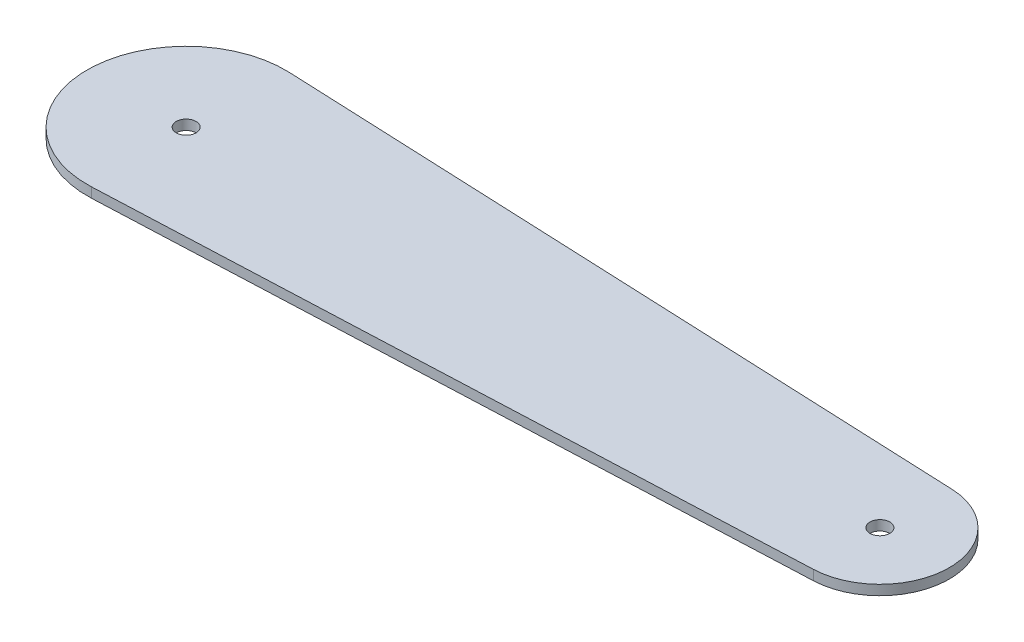
ISO-10303-21;
HEADER;
FILE_DESCRIPTION(('STEP AP214'),'2;1');
FILE_NAME('part.step','',(''),(''),'','','');
FILE_SCHEMA(('AUTOMOTIVE_DESIGN { 1 0 10303 214 1 1 1 1 }'));
ENDSEC;
DATA;
#1=APPLICATION_CONTEXT('core data for automotive mechanical design processes');
#2=APPLICATION_PROTOCOL_DEFINITION('international standard','automotive_design',2000,#1);
#3=PRODUCT_CONTEXT('',#1,'mechanical');
#4=PRODUCT('Part','Part','',(#3));
#5=PRODUCT_RELATED_PRODUCT_CATEGORY('part','',(#4));
#6=PRODUCT_DEFINITION_FORMATION('','',#4);
#7=PRODUCT_DEFINITION_CONTEXT('part definition',#1,'design');
#8=PRODUCT_DEFINITION('design','',#6,#7);
#9=PRODUCT_DEFINITION_SHAPE('','',#8);
#10=(LENGTH_UNIT() NAMED_UNIT(*) SI_UNIT(.MILLI.,.METRE.));
#11=(NAMED_UNIT(*) PLANE_ANGLE_UNIT() SI_UNIT($,.RADIAN.));
#12=(NAMED_UNIT(*) SI_UNIT($,.STERADIAN.) SOLID_ANGLE_UNIT());
#13=UNCERTAINTY_MEASURE_WITH_UNIT(LENGTH_MEASURE(1.E-05),#10,'distance_accuracy_value','');
#14=(GEOMETRIC_REPRESENTATION_CONTEXT(3) GLOBAL_UNCERTAINTY_ASSIGNED_CONTEXT((#13)) GLOBAL_UNIT_ASSIGNED_CONTEXT((#10,
#11,#12)) REPRESENTATION_CONTEXT('',''));
#15=CARTESIAN_POINT('',(0.,0.,0.));
#16=DIRECTION('',(0.,0.,1.));
#17=DIRECTION('',(1.,0.,0.));
#18=AXIS2_PLACEMENT_3D('',#15,#16,#17);
#19=CARTESIAN_POINT('',(0.,5.,0.));
#20=DIRECTION('',(0.,1.,0.));
#21=DIRECTION('',(0.,0.,1.));
#22=AXIS2_PLACEMENT_3D('',#19,#20,#21);
#23=PLANE('',#22);
#24=CARTESIAN_POINT('',(0.,5.,0.));
#25=DIRECTION('',(0.,1.,0.));
#26=DIRECTION('',(0.,0.,1.));
#27=AXIS2_PLACEMENT_3D('',#24,#25,#26);
#28=CIRCLE('',#27,5.);
#29=CARTESIAN_POINT('',(0.,5.,5.));
#30=VERTEX_POINT('',#29);
#31=EDGE_CURVE('E104',#30,#30,#28,.T.);
#32=ORIENTED_EDGE('',*,*,#31,.F.);
#33=EDGE_LOOP('',(#32));
#34=FACE_BOUND('',#33,.T.);
#35=CARTESIAN_POINT('',(0.,5.,0.));
#36=DIRECTION('',(0.,1.,0.));
#37=DIRECTION('',(0.,0.,1.));
#38=AXIS2_PLACEMENT_3D('',#35,#36,#37);
#39=CIRCLE('',#38,50.);
#40=CARTESIAN_POINT('',(2.14285714285714,5.,-49.9540605283025));
#41=VERTEX_POINT('',#40);
#42=CARTESIAN_POINT('',(2.14285714285714,5.,49.9540605283025));
#43=VERTEX_POINT('',#42);
#44=EDGE_CURVE('E89',#41,#43,#39,.T.);
#45=ORIENTED_EDGE('',*,*,#44,.T.);
#46=DIRECTION('',(0.999081210566049,0.,-0.0428571428571428));
#47=VECTOR('',#46,1.);
#48=CARTESIAN_POINT('',(2.14285714285714,5.,49.9540605283025));
#49=LINE('',#48,#47);
#50=CARTESIAN_POINT('',(351.5,5.,34.9678423698118));
#51=VERTEX_POINT('',#50);
#52=EDGE_CURVE('E84',#43,#51,#49,.T.);
#53=ORIENTED_EDGE('',*,*,#52,.T.);
#54=CARTESIAN_POINT('',(350.,5.,0.));
#55=DIRECTION('',(0.,1.,0.));
#56=DIRECTION('',(0.,0.,1.));
#57=AXIS2_PLACEMENT_3D('',#54,#55,#56);
#58=CIRCLE('',#57,35.);
#59=CARTESIAN_POINT('',(351.5,5.,-34.9678423698118));
#60=VERTEX_POINT('',#59);
#61=EDGE_CURVE('E87',#51,#60,#58,.T.);
#62=ORIENTED_EDGE('',*,*,#61,.T.);
#63=DIRECTION('',(-0.999081210566049,0.,-0.0428571428571428));
#64=VECTOR('',#63,1.);
#65=CARTESIAN_POINT('',(2.14285714285714,5.,-49.9540605283025));
#66=LINE('',#65,#64);
#67=EDGE_CURVE('E54',#60,#41,#66,.T.);
#68=ORIENTED_EDGE('',*,*,#67,.T.);
#69=EDGE_LOOP('',(#45,#53,#62,#68));
#70=FACE_BOUND('',#69,.T.);
#71=CARTESIAN_POINT('',(350.,5.,0.));
#72=DIRECTION('',(0.,1.,0.));
#73=DIRECTION('',(0.,0.,1.));
#74=AXIS2_PLACEMENT_3D('',#71,#72,#73);
#75=CIRCLE('',#74,4.99999999999999);
#76=CARTESIAN_POINT('',(350.,5.,4.99999999999999));
#77=VERTEX_POINT('',#76);
#78=EDGE_CURVE('E119',#77,#77,#75,.T.);
#79=ORIENTED_EDGE('',*,*,#78,.F.);
#80=EDGE_LOOP('',(#79));
#81=FACE_BOUND('',#80,.T.);
#82=ADVANCED_FACE('F37',(#34,#70,#81),#23,.T.);
#83=CARTESIAN_POINT('',(0.,0.,0.));
#84=DIRECTION('',(0.,1.,0.));
#85=DIRECTION('',(0.,0.,1.));
#86=AXIS2_PLACEMENT_3D('',#83,#84,#85);
#87=PLANE('',#86);
#88=CARTESIAN_POINT('',(0.,0.,0.));
#89=DIRECTION('',(0.,1.,0.));
#90=DIRECTION('',(0.,0.,1.));
#91=AXIS2_PLACEMENT_3D('',#88,#89,#90);
#92=CIRCLE('',#91,50.);
#93=CARTESIAN_POINT('',(2.14285714285714,0.,-49.9540605283025));
#94=VERTEX_POINT('',#93);
#95=CARTESIAN_POINT('',(2.14285714285714,0.,49.9540605283025));
#96=VERTEX_POINT('',#95);
#97=EDGE_CURVE('E101',#94,#96,#92,.T.);
#98=ORIENTED_EDGE('',*,*,#97,.F.);
#99=DIRECTION('',(-0.999081210566049,0.,-0.0428571428571428));
#100=VECTOR('',#99,1.);
#101=CARTESIAN_POINT('',(2.14285714285714,0.,-49.9540605283025));
#102=LINE('',#101,#100);
#103=CARTESIAN_POINT('',(351.5,0.,-34.9678423698118));
#104=VERTEX_POINT('',#103);
#105=EDGE_CURVE('E77',#104,#94,#102,.T.);
#106=ORIENTED_EDGE('',*,*,#105,.F.);
#107=CARTESIAN_POINT('',(350.,0.,0.));
#108=DIRECTION('',(0.,1.,0.));
#109=DIRECTION('',(0.,0.,1.));
#110=AXIS2_PLACEMENT_3D('',#107,#108,#109);
#111=CIRCLE('',#110,35.);
#112=CARTESIAN_POINT('',(351.5,0.,34.9678423698118));
#113=VERTEX_POINT('',#112);
#114=EDGE_CURVE('E71',#113,#104,#111,.T.);
#115=ORIENTED_EDGE('',*,*,#114,.F.);
#116=DIRECTION('',(0.999081210566049,0.,-0.0428571428571428));
#117=VECTOR('',#116,1.);
#118=CARTESIAN_POINT('',(2.14285714285714,0.,49.9540605283025));
#119=LINE('',#118,#117);
#120=EDGE_CURVE('E93',#96,#113,#119,.T.);
#121=ORIENTED_EDGE('',*,*,#120,.F.);
#122=EDGE_LOOP('',(#98,#106,#115,#121));
#123=FACE_BOUND('',#122,.T.);
#124=CARTESIAN_POINT('',(0.,0.,0.));
#125=DIRECTION('',(0.,1.,0.));
#126=DIRECTION('',(0.,0.,1.));
#127=AXIS2_PLACEMENT_3D('',#124,#125,#126);
#128=CIRCLE('',#127,5.);
#129=CARTESIAN_POINT('',(0.,0.,5.));
#130=VERTEX_POINT('',#129);
#131=EDGE_CURVE('E116',#130,#130,#128,.T.);
#132=ORIENTED_EDGE('',*,*,#131,.T.);
#133=EDGE_LOOP('',(#132));
#134=FACE_BOUND('',#133,.T.);
#135=CARTESIAN_POINT('',(350.,0.,0.));
#136=DIRECTION('',(0.,1.,0.));
#137=DIRECTION('',(0.,0.,1.));
#138=AXIS2_PLACEMENT_3D('',#135,#136,#137);
#139=CIRCLE('',#138,4.99999999999999);
#140=CARTESIAN_POINT('',(350.,0.,4.99999999999999));
#141=VERTEX_POINT('',#140);
#142=EDGE_CURVE('E122',#141,#141,#139,.T.);
#143=ORIENTED_EDGE('',*,*,#142,.T.);
#144=EDGE_LOOP('',(#143));
#145=FACE_BOUND('',#144,.T.);
#146=ADVANCED_FACE('F112',(#123,#134,#145),#87,.F.);
#147=CARTESIAN_POINT('',(0.,5.,0.));
#148=DIRECTION('',(0.,-1.,0.));
#149=DIRECTION('',(0.,0.,-1.));
#150=AXIS2_PLACEMENT_3D('',#147,#148,#149);
#151=CYLINDRICAL_SURFACE('',#150,50.);
#152=ORIENTED_EDGE('',*,*,#97,.T.);
#153=DIRECTION('',(0.,-1.,0.));
#154=VECTOR('',#153,1.);
#155=CARTESIAN_POINT('',(2.14285714285714,5.,49.9540605283025));
#156=LINE('',#155,#154);
#157=EDGE_CURVE('E11',#43,#96,#156,.T.);
#158=ORIENTED_EDGE('',*,*,#157,.F.);
#159=ORIENTED_EDGE('',*,*,#44,.F.);
#160=DIRECTION('',(0.,-1.,0.));
#161=VECTOR('',#160,1.);
#162=CARTESIAN_POINT('',(2.14285714285714,5.,-49.9540605283025));
#163=LINE('',#162,#161);
#164=EDGE_CURVE('E97',#41,#94,#163,.T.);
#165=ORIENTED_EDGE('',*,*,#164,.T.);
#166=EDGE_LOOP('',(#152,#158,#159,#165));
#167=FACE_BOUND('',#166,.T.);
#168=ADVANCED_FACE('F39',(#167),#151,.T.);
#169=CARTESIAN_POINT('',(2.14285714285714,5.,49.9540605283025));
#170=DIRECTION('',(-0.0428571428571428,0.,-0.999081210566049));
#171=DIRECTION('',(-0.999081210566049,0.,0.0428571428571428));
#172=AXIS2_PLACEMENT_3D('',#169,#170,#171);
#173=PLANE('',#172);
#174=ORIENTED_EDGE('',*,*,#120,.T.);
#175=DIRECTION('',(0.,-1.,0.));
#176=VECTOR('',#175,1.);
#177=CARTESIAN_POINT('',(351.5,5.,34.9678423698118));
#178=LINE('',#177,#176);
#179=EDGE_CURVE('E46',#51,#113,#178,.T.);
#180=ORIENTED_EDGE('',*,*,#179,.F.);
#181=ORIENTED_EDGE('',*,*,#52,.F.);
#182=ORIENTED_EDGE('',*,*,#157,.T.);
#183=EDGE_LOOP('',(#174,#180,#181,#182));
#184=FACE_BOUND('',#183,.T.);
#185=ADVANCED_FACE('F92',(#184),#173,.F.);
#186=CARTESIAN_POINT('',(350.,5.,0.));
#187=DIRECTION('',(0.,-1.,0.));
#188=DIRECTION('',(0.,0.,-1.));
#189=AXIS2_PLACEMENT_3D('',#186,#187,#188);
#190=CYLINDRICAL_SURFACE('',#189,35.);
#191=ORIENTED_EDGE('',*,*,#114,.T.);
#192=DIRECTION('',(0.,-1.,0.));
#193=VECTOR('',#192,1.);
#194=CARTESIAN_POINT('',(351.5,5.,-34.9678423698118));
#195=LINE('',#194,#193);
#196=EDGE_CURVE('E94',#60,#104,#195,.T.);
#197=ORIENTED_EDGE('',*,*,#196,.F.);
#198=ORIENTED_EDGE('',*,*,#61,.F.);
#199=ORIENTED_EDGE('',*,*,#179,.T.);
#200=EDGE_LOOP('',(#191,#197,#198,#199));
#201=FACE_BOUND('',#200,.T.);
#202=ADVANCED_FACE('F95',(#201),#190,.T.);
#203=CARTESIAN_POINT('',(2.14285714285714,5.,-49.9540605283025));
#204=DIRECTION('',(-0.0428571428571428,0.,0.999081210566049));
#205=DIRECTION('',(0.999081210566049,0.,0.0428571428571428));
#206=AXIS2_PLACEMENT_3D('',#203,#204,#205);
#207=PLANE('',#206);
#208=ORIENTED_EDGE('',*,*,#105,.T.);
#209=ORIENTED_EDGE('',*,*,#164,.F.);
#210=ORIENTED_EDGE('',*,*,#67,.F.);
#211=ORIENTED_EDGE('',*,*,#196,.T.);
#212=EDGE_LOOP('',(#208,#209,#210,#211));
#213=FACE_BOUND('',#212,.T.);
#214=ADVANCED_FACE('F109',(#213),#207,.F.);
#215=CARTESIAN_POINT('',(0.,5.,0.));
#216=DIRECTION('',(0.,-1.,0.));
#217=DIRECTION('',(0.,0.,-1.));
#218=AXIS2_PLACEMENT_3D('',#215,#216,#217);
#219=CYLINDRICAL_SURFACE('',#218,5.);
#220=ORIENTED_EDGE('',*,*,#31,.T.);
#221=EDGE_LOOP('',(#220));
#222=FACE_BOUND('',#221,.T.);
#223=ORIENTED_EDGE('',*,*,#131,.F.);
#224=EDGE_LOOP('',(#223));
#225=FACE_BOUND('',#224,.T.);
#226=ADVANCED_FACE('F139',(#222,#225),#219,.F.);
#227=CARTESIAN_POINT('',(350.,5.,0.));
#228=DIRECTION('',(0.,-1.,0.));
#229=DIRECTION('',(0.,0.,-1.));
#230=AXIS2_PLACEMENT_3D('',#227,#228,#229);
#231=CYLINDRICAL_SURFACE('',#230,4.99999999999999);
#232=ORIENTED_EDGE('',*,*,#78,.T.);
#233=EDGE_LOOP('',(#232));
#234=FACE_BOUND('',#233,.T.);
#235=ORIENTED_EDGE('',*,*,#142,.F.);
#236=EDGE_LOOP('',(#235));
#237=FACE_BOUND('',#236,.T.);
#238=ADVANCED_FACE('F128',(#234,#237),#231,.F.);
#239=CLOSED_SHELL('',(#82,#146,#168,#185,#202,#214,#226,#238));
#240=MANIFOLD_SOLID_BREP('B2',#239);
#241=ADVANCED_BREP_SHAPE_REPRESENTATION('',(#18,#240),#14);
#242=SHAPE_DEFINITION_REPRESENTATION(#9,#241);
ENDSEC;
END-ISO-10303-21;
